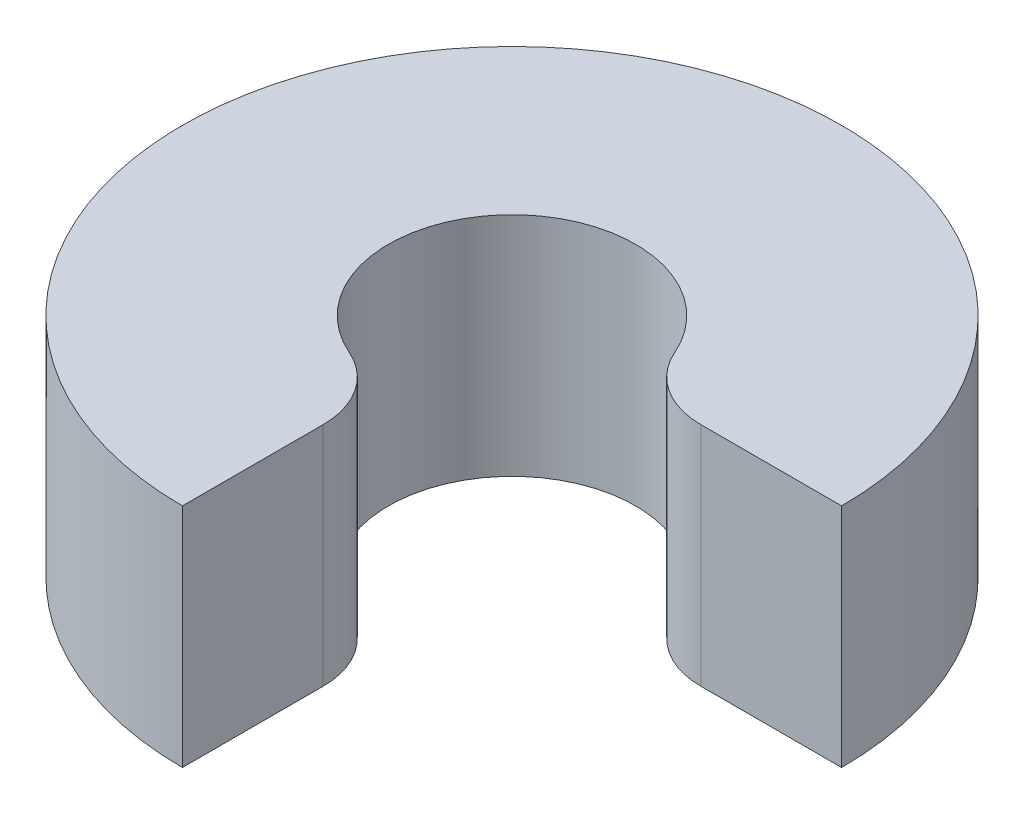
ISO-10303-21;
HEADER;
FILE_DESCRIPTION(('STEP AP214'),'2;1');
FILE_NAME('part.step','',(''),(''),'','','');
FILE_SCHEMA(('AUTOMOTIVE_DESIGN { 1 0 10303 214 1 1 1 1 }'));
ENDSEC;
DATA;
#1=APPLICATION_CONTEXT('core data for automotive mechanical design processes');
#2=APPLICATION_PROTOCOL_DEFINITION('international standard','automotive_design',2000,#1);
#3=PRODUCT_CONTEXT('',#1,'mechanical');
#4=PRODUCT('Part','Part','',(#3));
#5=PRODUCT_RELATED_PRODUCT_CATEGORY('part','',(#4));
#6=PRODUCT_DEFINITION_FORMATION('','',#4);
#7=PRODUCT_DEFINITION_CONTEXT('part definition',#1,'design');
#8=PRODUCT_DEFINITION('design','',#6,#7);
#9=PRODUCT_DEFINITION_SHAPE('','',#8);
#10=(LENGTH_UNIT() NAMED_UNIT(*) SI_UNIT(.MILLI.,.METRE.));
#11=(NAMED_UNIT(*) PLANE_ANGLE_UNIT() SI_UNIT($,.RADIAN.));
#12=(NAMED_UNIT(*) SI_UNIT($,.STERADIAN.) SOLID_ANGLE_UNIT());
#13=UNCERTAINTY_MEASURE_WITH_UNIT(LENGTH_MEASURE(1.E-05),#10,'distance_accuracy_value','');
#14=(GEOMETRIC_REPRESENTATION_CONTEXT(3) GLOBAL_UNCERTAINTY_ASSIGNED_CONTEXT((#13)) GLOBAL_UNIT_ASSIGNED_CONTEXT((#10,
#11,#12)) REPRESENTATION_CONTEXT('',''));
#15=CARTESIAN_POINT('',(0.,0.,0.));
#16=DIRECTION('',(0.,0.,1.));
#17=DIRECTION('',(1.,0.,0.));
#18=AXIS2_PLACEMENT_3D('',#15,#16,#17);
#19=CARTESIAN_POINT('',(0.,2.75,0.));
#20=DIRECTION('',(0.,-1.,0.));
#21=DIRECTION('',(0.,0.,-1.));
#22=AXIS2_PLACEMENT_3D('',#19,#20,#21);
#23=CYLINDRICAL_SURFACE('',#22,1.5);
#24=CARTESIAN_POINT('',(0.,2.75,0.));
#25=DIRECTION('',(0.,-1.,0.));
#26=DIRECTION('',(0.,0.,1.));
#27=AXIS2_PLACEMENT_3D('',#24,#25,#26);
#28=CIRCLE('',#27,1.5);
#29=CARTESIAN_POINT('',(-0.600000000000005,2.75,1.37477270848675));
#30=VERTEX_POINT('',#29);
#31=CARTESIAN_POINT('',(1.37477270848675,2.75,-0.599999999999999));
#32=VERTEX_POINT('',#31);
#33=EDGE_CURVE('E102',#30,#32,#28,.T.);
#34=ORIENTED_EDGE('',*,*,#33,.F.);
#35=DIRECTION('',(0.,-1.,0.));
#36=VECTOR('',#35,1.);
#37=CARTESIAN_POINT('',(-0.600000000000005,2.75,1.37477270848675));
#38=LINE('',#37,#36);
#39=CARTESIAN_POINT('',(-0.600000000000005,0.,1.37477270848675));
#40=VERTEX_POINT('',#39);
#41=EDGE_CURVE('E131',#30,#40,#38,.T.);
#42=ORIENTED_EDGE('',*,*,#41,.T.);
#43=CARTESIAN_POINT('',(0.,0.,0.));
#44=DIRECTION('',(0.,-1.,0.));
#45=DIRECTION('',(0.,0.,1.));
#46=AXIS2_PLACEMENT_3D('',#43,#44,#45);
#47=CIRCLE('',#46,1.5);
#48=CARTESIAN_POINT('',(1.37477270848675,0.,-0.599999999999999));
#49=VERTEX_POINT('',#48);
#50=EDGE_CURVE('E121',#40,#49,#47,.T.);
#51=ORIENTED_EDGE('',*,*,#50,.T.);
#52=DIRECTION('',(0.,-1.,0.));
#53=VECTOR('',#52,1.);
#54=CARTESIAN_POINT('',(1.37477270848675,2.75,-0.599999999999999));
#55=LINE('',#54,#53);
#56=EDGE_CURVE('E111',#49,#32,#55,.F.);
#57=ORIENTED_EDGE('',*,*,#56,.T.);
#58=EDGE_LOOP('',(#34,#42,#51,#57));
#59=FACE_BOUND('',#58,.T.);
#60=ADVANCED_FACE('F41',(#59),#23,.F.);
#61=CARTESIAN_POINT('',(1.5,2.75,0.));
#62=DIRECTION('',(0.,0.,-1.));
#63=DIRECTION('',(-1.,0.,0.));
#64=AXIS2_PLACEMENT_3D('',#61,#62,#63);
#65=PLANE('',#64);
#66=DIRECTION('',(1.,0.,0.));
#67=VECTOR('',#66,1.);
#68=CARTESIAN_POINT('',(1.5,2.75,0.));
#69=LINE('',#68,#67);
#70=CARTESIAN_POINT('',(2.29128784747792,2.75,0.));
#71=VERTEX_POINT('',#70);
#72=CARTESIAN_POINT('',(4.,2.75,0.));
#73=VERTEX_POINT('',#72);
#74=EDGE_CURVE('E94',#71,#73,#69,.T.);
#75=ORIENTED_EDGE('',*,*,#74,.F.);
#76=DIRECTION('',(0.,-1.,0.));
#77=VECTOR('',#76,1.);
#78=CARTESIAN_POINT('',(2.29128784747792,2.75,0.));
#79=LINE('',#78,#77);
#80=CARTESIAN_POINT('',(2.29128784747792,0.,0.));
#81=VERTEX_POINT('',#80);
#82=EDGE_CURVE('E11',#71,#81,#79,.T.);
#83=ORIENTED_EDGE('',*,*,#82,.T.);
#84=DIRECTION('',(1.,0.,0.));
#85=VECTOR('',#84,1.);
#86=CARTESIAN_POINT('',(1.5,0.,0.));
#87=LINE('',#86,#85);
#88=CARTESIAN_POINT('',(4.,0.,0.));
#89=VERTEX_POINT('',#88);
#90=EDGE_CURVE('E108',#81,#89,#87,.T.);
#91=ORIENTED_EDGE('',*,*,#90,.T.);
#92=DIRECTION('',(0.,-1.,0.));
#93=VECTOR('',#92,1.);
#94=CARTESIAN_POINT('',(4.,2.75,0.));
#95=LINE('',#94,#93);
#96=EDGE_CURVE('E105',#73,#89,#95,.T.);
#97=ORIENTED_EDGE('',*,*,#96,.F.);
#98=EDGE_LOOP('',(#75,#83,#91,#97));
#99=FACE_BOUND('',#98,.T.);
#100=ADVANCED_FACE('F106',(#99),#65,.F.);
#101=CARTESIAN_POINT('',(0.,2.75,0.));
#102=DIRECTION('',(0.,-1.,0.));
#103=DIRECTION('',(0.,0.,-1.));
#104=AXIS2_PLACEMENT_3D('',#101,#102,#103);
#105=CYLINDRICAL_SURFACE('',#104,4.);
#106=CARTESIAN_POINT('',(0.,0.,0.));
#107=DIRECTION('',(0.,1.,0.));
#108=DIRECTION('',(0.,0.,1.));
#109=AXIS2_PLACEMENT_3D('',#106,#107,#108);
#110=CIRCLE('',#109,4.);
#111=CARTESIAN_POINT('',(0.,0.,4.));
#112=VERTEX_POINT('',#111);
#113=EDGE_CURVE('E125',#89,#112,#110,.T.);
#114=ORIENTED_EDGE('',*,*,#113,.T.);
#115=DIRECTION('',(0.,-1.,0.));
#116=VECTOR('',#115,1.);
#117=CARTESIAN_POINT('',(0.,2.75,4.));
#118=LINE('',#117,#116);
#119=CARTESIAN_POINT('',(0.,2.75,4.));
#120=VERTEX_POINT('',#119);
#121=EDGE_CURVE('E112',#120,#112,#118,.T.);
#122=ORIENTED_EDGE('',*,*,#121,.F.);
#123=CARTESIAN_POINT('',(0.,2.75,0.));
#124=DIRECTION('',(0.,1.,0.));
#125=DIRECTION('',(0.,0.,1.));
#126=AXIS2_PLACEMENT_3D('',#123,#124,#125);
#127=CIRCLE('',#126,4.);
#128=EDGE_CURVE('E98',#73,#120,#127,.T.);
#129=ORIENTED_EDGE('',*,*,#128,.F.);
#130=ORIENTED_EDGE('',*,*,#96,.T.);
#131=EDGE_LOOP('',(#114,#122,#129,#130));
#132=FACE_BOUND('',#131,.T.);
#133=ADVANCED_FACE('F114',(#132),#105,.T.);
#134=CARTESIAN_POINT('',(0.,2.75,1.5));
#135=DIRECTION('',(-1.,0.,0.));
#136=DIRECTION('',(0.,0.,1.));
#137=AXIS2_PLACEMENT_3D('',#134,#135,#136);
#138=PLANE('',#137);
#139=DIRECTION('',(0.,0.,-1.));
#140=VECTOR('',#139,1.);
#141=CARTESIAN_POINT('',(0.,0.,1.5));
#142=LINE('',#141,#140);
#143=CARTESIAN_POINT('',(0.,0.,2.29128784747792));
#144=VERTEX_POINT('',#143);
#145=EDGE_CURVE('E127',#112,#144,#142,.T.);
#146=ORIENTED_EDGE('',*,*,#145,.T.);
#147=DIRECTION('',(0.,-1.,0.));
#148=VECTOR('',#147,1.);
#149=CARTESIAN_POINT('',(0.,2.75,2.29128784747792));
#150=LINE('',#149,#148);
#151=CARTESIAN_POINT('',(0.,2.75,2.29128784747792));
#152=VERTEX_POINT('',#151);
#153=EDGE_CURVE('E64',#144,#152,#150,.F.);
#154=ORIENTED_EDGE('',*,*,#153,.T.);
#155=DIRECTION('',(0.,0.,-1.));
#156=VECTOR('',#155,1.);
#157=CARTESIAN_POINT('',(0.,2.75,1.5));
#158=LINE('',#157,#156);
#159=EDGE_CURVE('E116',#120,#152,#158,.T.);
#160=ORIENTED_EDGE('',*,*,#159,.F.);
#161=ORIENTED_EDGE('',*,*,#121,.T.);
#162=EDGE_LOOP('',(#146,#154,#160,#161));
#163=FACE_BOUND('',#162,.T.);
#164=ADVANCED_FACE('F150',(#163),#138,.F.);
#165=CARTESIAN_POINT('',(0.,2.75,0.));
#166=DIRECTION('',(0.,1.,0.));
#167=DIRECTION('',(0.,0.,1.));
#168=AXIS2_PLACEMENT_3D('',#165,#166,#167);
#169=PLANE('',#168);
#170=ORIENTED_EDGE('',*,*,#159,.T.);
#171=CARTESIAN_POINT('',(-1.00000000000001,2.75,2.29128784747792));
#172=DIRECTION('',(0.,1.,0.));
#173=DIRECTION('',(0.,0.,1.));
#174=AXIS2_PLACEMENT_3D('',#171,#172,#173);
#175=CIRCLE('',#174,1.);
#176=EDGE_CURVE('E49',#152,#30,#175,.T.);
#177=ORIENTED_EDGE('',*,*,#176,.T.);
#178=ORIENTED_EDGE('',*,*,#33,.T.);
#179=CARTESIAN_POINT('',(2.29128784747792,2.75,-0.999999999999999));
#180=DIRECTION('',(0.,1.,0.));
#181=DIRECTION('',(0.,0.,1.));
#182=AXIS2_PLACEMENT_3D('',#179,#180,#181);
#183=CIRCLE('',#182,1.);
#184=EDGE_CURVE('E56',#32,#71,#183,.T.);
#185=ORIENTED_EDGE('',*,*,#184,.T.);
#186=ORIENTED_EDGE('',*,*,#74,.T.);
#187=ORIENTED_EDGE('',*,*,#128,.T.);
#188=EDGE_LOOP('',(#170,#177,#178,#185,#186,#187));
#189=FACE_BOUND('',#188,.T.);
#190=ADVANCED_FACE('F96',(#189),#169,.T.);
#191=CARTESIAN_POINT('',(0.,0.,0.));
#192=DIRECTION('',(0.,1.,0.));
#193=DIRECTION('',(0.,0.,1.));
#194=AXIS2_PLACEMENT_3D('',#191,#192,#193);
#195=PLANE('',#194);
#196=ORIENTED_EDGE('',*,*,#50,.F.);
#197=CARTESIAN_POINT('',(-1.00000000000001,0.,2.29128784747792));
#198=DIRECTION('',(0.,1.,0.));
#199=DIRECTION('',(0.,0.,1.));
#200=AXIS2_PLACEMENT_3D('',#197,#198,#199);
#201=CIRCLE('',#200,1.);
#202=EDGE_CURVE('E136',#40,#144,#201,.F.);
#203=ORIENTED_EDGE('',*,*,#202,.T.);
#204=ORIENTED_EDGE('',*,*,#145,.F.);
#205=ORIENTED_EDGE('',*,*,#113,.F.);
#206=ORIENTED_EDGE('',*,*,#90,.F.);
#207=CARTESIAN_POINT('',(2.29128784747792,0.,-0.999999999999999));
#208=DIRECTION('',(0.,1.,0.));
#209=DIRECTION('',(0.,0.,1.));
#210=AXIS2_PLACEMENT_3D('',#207,#208,#209);
#211=CIRCLE('',#210,1.);
#212=EDGE_CURVE('E134',#81,#49,#211,.F.);
#213=ORIENTED_EDGE('',*,*,#212,.T.);
#214=EDGE_LOOP('',(#196,#203,#204,#205,#206,#213));
#215=FACE_BOUND('',#214,.T.);
#216=ADVANCED_FACE('F149',(#215),#195,.F.);
#217=CARTESIAN_POINT('',(-1.00000000000001,2.75,2.29128784747792));
#218=DIRECTION('',(0.,-1.,0.));
#219=DIRECTION('',(0.,0.,-1.));
#220=AXIS2_PLACEMENT_3D('',#217,#218,#219);
#221=CYLINDRICAL_SURFACE('',#220,1.);
#222=ORIENTED_EDGE('',*,*,#176,.F.);
#223=ORIENTED_EDGE('',*,*,#153,.F.);
#224=ORIENTED_EDGE('',*,*,#202,.F.);
#225=ORIENTED_EDGE('',*,*,#41,.F.);
#226=EDGE_LOOP('',(#222,#223,#224,#225));
#227=FACE_BOUND('',#226,.T.);
#228=ADVANCED_FACE('F146',(#227),#221,.T.);
#229=CARTESIAN_POINT('',(2.29128784747792,2.75,-0.999999999999999));
#230=DIRECTION('',(0.,-1.,0.));
#231=DIRECTION('',(0.,0.,-1.));
#232=AXIS2_PLACEMENT_3D('',#229,#230,#231);
#233=CYLINDRICAL_SURFACE('',#232,1.);
#234=ORIENTED_EDGE('',*,*,#184,.F.);
#235=ORIENTED_EDGE('',*,*,#56,.F.);
#236=ORIENTED_EDGE('',*,*,#212,.F.);
#237=ORIENTED_EDGE('',*,*,#82,.F.);
#238=EDGE_LOOP('',(#234,#235,#236,#237));
#239=FACE_BOUND('',#238,.T.);
#240=ADVANCED_FACE('F43',(#239),#233,.T.);
#241=CLOSED_SHELL('',(#60,#100,#133,#164,#190,#216,#228,#240));
#242=MANIFOLD_SOLID_BREP('B2',#241);
#243=ADVANCED_BREP_SHAPE_REPRESENTATION('',(#18,#242),#14);
#244=SHAPE_DEFINITION_REPRESENTATION(#9,#243);
ENDSEC;
END-ISO-10303-21;
